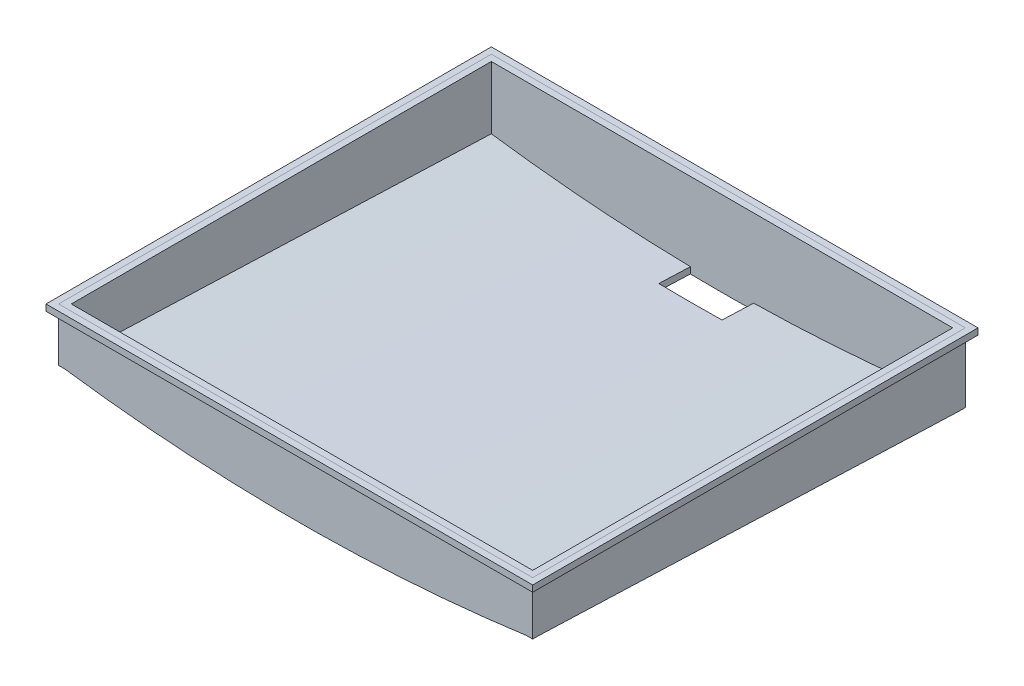
ISO-10303-21;
HEADER;
FILE_DESCRIPTION(('STEP AP214'),'2;1');
FILE_NAME('part.step','',(''),(''),'','','');
FILE_SCHEMA(('AUTOMOTIVE_DESIGN { 1 0 10303 214 1 1 1 1 }'));
ENDSEC;
DATA;
#1=APPLICATION_CONTEXT('core data for automotive mechanical design processes');
#2=APPLICATION_PROTOCOL_DEFINITION('international standard','automotive_design',2000,#1);
#3=PRODUCT_CONTEXT('',#1,'mechanical');
#4=PRODUCT('Part','Part','',(#3));
#5=PRODUCT_RELATED_PRODUCT_CATEGORY('part','',(#4));
#6=PRODUCT_DEFINITION_FORMATION('','',#4);
#7=PRODUCT_DEFINITION_CONTEXT('part definition',#1,'design');
#8=PRODUCT_DEFINITION('design','',#6,#7);
#9=PRODUCT_DEFINITION_SHAPE('','',#8);
#10=(LENGTH_UNIT() NAMED_UNIT(*) SI_UNIT(.MILLI.,.METRE.));
#11=(NAMED_UNIT(*) PLANE_ANGLE_UNIT() SI_UNIT($,.RADIAN.));
#12=(NAMED_UNIT(*) SI_UNIT($,.STERADIAN.) SOLID_ANGLE_UNIT());
#13=UNCERTAINTY_MEASURE_WITH_UNIT(LENGTH_MEASURE(1.E-05),#10,'distance_accuracy_value','');
#14=(GEOMETRIC_REPRESENTATION_CONTEXT(3) GLOBAL_UNCERTAINTY_ASSIGNED_CONTEXT((#13)) GLOBAL_UNIT_ASSIGNED_CONTEXT((#10,
#11,#12)) REPRESENTATION_CONTEXT('',''));
#15=CARTESIAN_POINT('',(0.,0.,0.));
#16=DIRECTION('',(0.,0.,1.));
#17=DIRECTION('',(1.,0.,0.));
#18=AXIS2_PLACEMENT_3D('',#15,#16,#17);
#19=CARTESIAN_POINT('',(-77.,12.8274877494664,-136.906114542662));
#20=DIRECTION('',(0.,0.,-1.));
#21=DIRECTION('',(-1.,0.,0.));
#22=AXIS2_PLACEMENT_3D('',#19,#20,#21);
#23=PLANE('',#22);
#24=DIRECTION('',(-1.,0.,0.));
#25=VECTOR('',#24,1.);
#26=CARTESIAN_POINT('',(-77.,14.8274877494664,-136.906114542662));
#27=LINE('',#26,#25);
#28=CARTESIAN_POINT('',(77.,14.8274877494664,-136.906114542662));
#29=VERTEX_POINT('',#28);
#30=CARTESIAN_POINT('',(-77.,14.8274877494664,-136.906114542662));
#31=VERTEX_POINT('',#30);
#32=EDGE_CURVE('E144',#29,#31,#27,.T.);
#33=ORIENTED_EDGE('',*,*,#32,.F.);
#34=DIRECTION('',(0.,1.,0.));
#35=VECTOR('',#34,1.);
#36=CARTESIAN_POINT('',(77.,12.8274877494664,-136.906114542662));
#37=LINE('',#36,#35);
#38=CARTESIAN_POINT('',(77.,12.8274877494664,-136.906114542662));
#39=VERTEX_POINT('',#38);
#40=EDGE_CURVE('E12',#39,#29,#37,.T.);
#41=ORIENTED_EDGE('',*,*,#40,.F.);
#42=DIRECTION('',(-1.,0.,0.));
#43=VECTOR('',#42,1.);
#44=CARTESIAN_POINT('',(-77.,12.8274877494664,-136.906114542662));
#45=LINE('',#44,#43);
#46=CARTESIAN_POINT('',(-77.,12.8274877494664,-136.906114542662));
#47=VERTEX_POINT('',#46);
#48=EDGE_CURVE('E148',#39,#47,#45,.T.);
#49=ORIENTED_EDGE('',*,*,#48,.T.);
#50=DIRECTION('',(0.,1.,0.));
#51=VECTOR('',#50,1.);
#52=CARTESIAN_POINT('',(-77.,12.8274877494664,-136.906114542662));
#53=LINE('',#52,#51);
#54=EDGE_CURVE('E49',#47,#31,#53,.T.);
#55=ORIENTED_EDGE('',*,*,#54,.T.);
#56=EDGE_LOOP('',(#33,#41,#49,#55));
#57=FACE_BOUND('',#56,.T.);
#58=ADVANCED_FACE('F46',(#57),#23,.T.);
#59=CARTESIAN_POINT('',(77.,12.8274877494664,-136.906114542662));
#60=DIRECTION('',(1.,0.,0.));
#61=DIRECTION('',(0.,0.,-1.));
#62=AXIS2_PLACEMENT_3D('',#59,#60,#61);
#63=PLANE('',#62);
#64=DIRECTION('',(0.,0.,-1.));
#65=VECTOR('',#64,1.);
#66=CARTESIAN_POINT('',(77.,14.8274877494664,-136.906114542662));
#67=LINE('',#66,#65);
#68=CARTESIAN_POINT('',(77.,14.8274877494664,4.));
#69=VERTEX_POINT('',#68);
#70=EDGE_CURVE('E152',#69,#29,#67,.T.);
#71=ORIENTED_EDGE('',*,*,#70,.F.);
#72=DIRECTION('',(0.,1.,0.));
#73=VECTOR('',#72,1.);
#74=CARTESIAN_POINT('',(77.,12.8274877494664,4.));
#75=LINE('',#74,#73);
#76=CARTESIAN_POINT('',(77.,12.8274877494664,4.));
#77=VERTEX_POINT('',#76);
#78=EDGE_CURVE('E54',#77,#69,#75,.T.);
#79=ORIENTED_EDGE('',*,*,#78,.F.);
#80=DIRECTION('',(0.,0.,-1.));
#81=VECTOR('',#80,1.);
#82=CARTESIAN_POINT('',(77.,12.8274877494664,-136.906114542662));
#83=LINE('',#82,#81);
#84=EDGE_CURVE('E158',#77,#39,#83,.T.);
#85=ORIENTED_EDGE('',*,*,#84,.T.);
#86=ORIENTED_EDGE('',*,*,#40,.T.);
#87=EDGE_LOOP('',(#71,#79,#85,#86));
#88=FACE_BOUND('',#87,.T.);
#89=ADVANCED_FACE('F184',(#88),#63,.T.);
#90=CARTESIAN_POINT('',(-77.,12.8274877494664,4.));
#91=DIRECTION('',(0.,0.,1.));
#92=DIRECTION('',(1.,0.,0.));
#93=AXIS2_PLACEMENT_3D('',#90,#91,#92);
#94=PLANE('',#93);
#95=DIRECTION('',(1.,0.,0.));
#96=VECTOR('',#95,1.);
#97=CARTESIAN_POINT('',(-77.,14.8274877494664,4.));
#98=LINE('',#97,#96);
#99=CARTESIAN_POINT('',(-77.,14.8274877494664,4.));
#100=VERTEX_POINT('',#99);
#101=EDGE_CURVE('E166',#100,#69,#98,.T.);
#102=ORIENTED_EDGE('',*,*,#101,.F.);
#103=DIRECTION('',(0.,1.,0.));
#104=VECTOR('',#103,1.);
#105=CARTESIAN_POINT('',(-77.,12.8274877494664,4.));
#106=LINE('',#105,#104);
#107=CARTESIAN_POINT('',(-77.,12.8274877494664,4.));
#108=VERTEX_POINT('',#107);
#109=EDGE_CURVE('E171',#108,#100,#106,.T.);
#110=ORIENTED_EDGE('',*,*,#109,.F.);
#111=DIRECTION('',(1.,0.,0.));
#112=VECTOR('',#111,1.);
#113=CARTESIAN_POINT('',(-77.,12.8274877494664,4.));
#114=LINE('',#113,#112);
#115=EDGE_CURVE('E155',#108,#77,#114,.T.);
#116=ORIENTED_EDGE('',*,*,#115,.T.);
#117=ORIENTED_EDGE('',*,*,#78,.T.);
#118=EDGE_LOOP('',(#102,#110,#116,#117));
#119=FACE_BOUND('',#118,.T.);
#120=ADVANCED_FACE('F188',(#119),#94,.T.);
#121=CARTESIAN_POINT('',(-77.,12.8274877494664,-136.906114542662));
#122=DIRECTION('',(-1.,0.,0.));
#123=DIRECTION('',(0.,0.,1.));
#124=AXIS2_PLACEMENT_3D('',#121,#122,#123);
#125=PLANE('',#124);
#126=DIRECTION('',(0.,0.,1.));
#127=VECTOR('',#126,1.);
#128=CARTESIAN_POINT('',(-77.,14.8274877494664,-136.906114542662));
#129=LINE('',#128,#127);
#130=EDGE_CURVE('E163',#31,#100,#129,.T.);
#131=ORIENTED_EDGE('',*,*,#130,.F.);
#132=ORIENTED_EDGE('',*,*,#54,.F.);
#133=DIRECTION('',(0.,0.,1.));
#134=VECTOR('',#133,1.);
#135=CARTESIAN_POINT('',(-77.,12.8274877494664,-136.906114542662));
#136=LINE('',#135,#134);
#137=EDGE_CURVE('E151',#47,#108,#136,.T.);
#138=ORIENTED_EDGE('',*,*,#137,.T.);
#139=ORIENTED_EDGE('',*,*,#109,.T.);
#140=EDGE_LOOP('',(#131,#132,#138,#139));
#141=FACE_BOUND('',#140,.T.);
#142=ADVANCED_FACE('F179',(#141),#125,.T.);
#143=CARTESIAN_POINT('',(0.,12.8274877494664,0.));
#144=DIRECTION('',(0.,-1.,0.));
#145=DIRECTION('',(0.,0.,-1.));
#146=AXIS2_PLACEMENT_3D('',#143,#144,#145);
#147=PLANE('',#146);
#148=DIRECTION('',(0.,0.,1.));
#149=VECTOR('',#148,1.);
#150=CARTESIAN_POINT('',(-75.,12.8274877494664,-134.906114542662));
#151=LINE('',#150,#149);
#152=CARTESIAN_POINT('',(-75.,12.8274877494664,-134.906114542662));
#153=VERTEX_POINT('',#152);
#154=CARTESIAN_POINT('',(-75.,12.8274877494664,2.));
#155=VERTEX_POINT('',#154);
#156=EDGE_CURVE('E113',#153,#155,#151,.T.);
#157=ORIENTED_EDGE('',*,*,#156,.T.);
#158=DIRECTION('',(1.,0.,0.));
#159=VECTOR('',#158,1.);
#160=CARTESIAN_POINT('',(-75.,12.8274877494664,2.));
#161=LINE('',#160,#159);
#162=CARTESIAN_POINT('',(75.,12.8274877494664,2.));
#163=VERTEX_POINT('',#162);
#164=EDGE_CURVE('E122',#155,#163,#161,.T.);
#165=ORIENTED_EDGE('',*,*,#164,.T.);
#166=DIRECTION('',(0.,0.,-1.));
#167=VECTOR('',#166,1.);
#168=CARTESIAN_POINT('',(75.,12.8274877494664,-134.906114542662));
#169=LINE('',#168,#167);
#170=CARTESIAN_POINT('',(75.,12.8274877494664,-134.906114542662));
#171=VERTEX_POINT('',#170);
#172=EDGE_CURVE('E62',#163,#171,#169,.T.);
#173=ORIENTED_EDGE('',*,*,#172,.T.);
#174=DIRECTION('',(-1.,0.,0.));
#175=VECTOR('',#174,1.);
#176=CARTESIAN_POINT('',(-75.,12.8274877494664,-134.906114542662));
#177=LINE('',#176,#175);
#178=EDGE_CURVE('E119',#171,#153,#177,.T.);
#179=ORIENTED_EDGE('',*,*,#178,.T.);
#180=EDGE_LOOP('',(#157,#165,#173,#179));
#181=FACE_BOUND('',#180,.T.);
#182=ORIENTED_EDGE('',*,*,#48,.F.);
#183=ORIENTED_EDGE('',*,*,#84,.F.);
#184=ORIENTED_EDGE('',*,*,#115,.F.);
#185=ORIENTED_EDGE('',*,*,#137,.F.);
#186=EDGE_LOOP('',(#182,#183,#184,#185));
#187=FACE_BOUND('',#186,.T.);
#188=ADVANCED_FACE('F126',(#181,#187),#147,.T.);
#189=CARTESIAN_POINT('',(0.,14.8274877494664,0.));
#190=DIRECTION('',(0.,-1.,0.));
#191=DIRECTION('',(0.,0.,-1.));
#192=AXIS2_PLACEMENT_3D('',#189,#190,#191);
#193=PLANE('',#192);
#194=DIRECTION('',(1.,0.,0.));
#195=VECTOR('',#194,1.);
#196=CARTESIAN_POINT('',(-75.,14.8274877494664,2.));
#197=LINE('',#196,#195);
#198=CARTESIAN_POINT('',(-75.,14.8274877494664,2.));
#199=VERTEX_POINT('',#198);
#200=CARTESIAN_POINT('',(75.,14.8274877494664,2.));
#201=VERTEX_POINT('',#200);
#202=EDGE_CURVE('E138',#199,#201,#197,.T.);
#203=ORIENTED_EDGE('',*,*,#202,.F.);
#204=DIRECTION('',(0.,0.,1.));
#205=VECTOR('',#204,1.);
#206=CARTESIAN_POINT('',(-75.,14.8274877494664,-134.906114542662));
#207=LINE('',#206,#205);
#208=CARTESIAN_POINT('',(-75.,14.8274877494664,-134.906114542662));
#209=VERTEX_POINT('',#208);
#210=EDGE_CURVE('E70',#209,#199,#207,.T.);
#211=ORIENTED_EDGE('',*,*,#210,.F.);
#212=DIRECTION('',(-1.,0.,0.));
#213=VECTOR('',#212,1.);
#214=CARTESIAN_POINT('',(-75.,14.8274877494664,-134.906114542662));
#215=LINE('',#214,#213);
#216=CARTESIAN_POINT('',(75.,14.8274877494664,-134.906114542662));
#217=VERTEX_POINT('',#216);
#218=EDGE_CURVE('E129',#217,#209,#215,.T.);
#219=ORIENTED_EDGE('',*,*,#218,.F.);
#220=DIRECTION('',(0.,0.,-1.));
#221=VECTOR('',#220,1.);
#222=CARTESIAN_POINT('',(75.,14.8274877494664,-134.906114542662));
#223=LINE('',#222,#221);
#224=EDGE_CURVE('E132',#201,#217,#223,.T.);
#225=ORIENTED_EDGE('',*,*,#224,.F.);
#226=EDGE_LOOP('',(#203,#211,#219,#225));
#227=FACE_BOUND('',#226,.T.);
#228=ORIENTED_EDGE('',*,*,#32,.T.);
#229=ORIENTED_EDGE('',*,*,#130,.T.);
#230=ORIENTED_EDGE('',*,*,#101,.T.);
#231=ORIENTED_EDGE('',*,*,#70,.T.);
#232=EDGE_LOOP('',(#228,#229,#230,#231));
#233=FACE_BOUND('',#232,.T.);
#234=ADVANCED_FACE('F181',(#227,#233),#193,.F.);
#235=CARTESIAN_POINT('',(-75.,12.8274877494664,-134.906114542662));
#236=DIRECTION('',(-1.,0.,0.));
#237=DIRECTION('',(0.,0.,1.));
#238=AXIS2_PLACEMENT_3D('',#235,#236,#237);
#239=PLANE('',#238);
#240=ORIENTED_EDGE('',*,*,#210,.T.);
#241=DIRECTION('',(0.,1.,0.));
#242=VECTOR('',#241,1.);
#243=CARTESIAN_POINT('',(-75.,12.8274877494664,2.));
#244=LINE('',#243,#242);
#245=EDGE_CURVE('E109',#155,#199,#244,.T.);
#246=ORIENTED_EDGE('',*,*,#245,.F.);
#247=ORIENTED_EDGE('',*,*,#156,.F.);
#248=DIRECTION('',(0.,1.,0.));
#249=VECTOR('',#248,1.);
#250=CARTESIAN_POINT('',(-75.,12.8274877494664,-134.906114542662));
#251=LINE('',#250,#249);
#252=EDGE_CURVE('E142',#153,#209,#251,.T.);
#253=ORIENTED_EDGE('',*,*,#252,.T.);
#254=EDGE_LOOP('',(#240,#246,#247,#253));
#255=FACE_BOUND('',#254,.T.);
#256=ADVANCED_FACE('F111',(#255),#239,.F.);
#257=CARTESIAN_POINT('',(-75.,12.8274877494664,-134.906114542662));
#258=DIRECTION('',(0.,0.,-1.));
#259=DIRECTION('',(-1.,0.,0.));
#260=AXIS2_PLACEMENT_3D('',#257,#258,#259);
#261=PLANE('',#260);
#262=ORIENTED_EDGE('',*,*,#218,.T.);
#263=ORIENTED_EDGE('',*,*,#252,.F.);
#264=ORIENTED_EDGE('',*,*,#178,.F.);
#265=DIRECTION('',(0.,1.,0.));
#266=VECTOR('',#265,1.);
#267=CARTESIAN_POINT('',(75.,12.8274877494664,-134.906114542662));
#268=LINE('',#267,#266);
#269=EDGE_CURVE('E145',#171,#217,#268,.T.);
#270=ORIENTED_EDGE('',*,*,#269,.T.);
#271=EDGE_LOOP('',(#262,#263,#264,#270));
#272=FACE_BOUND('',#271,.T.);
#273=ADVANCED_FACE('F239',(#272),#261,.F.);
#274=CARTESIAN_POINT('',(75.,12.8274877494664,-134.906114542662));
#275=DIRECTION('',(1.,0.,0.));
#276=DIRECTION('',(0.,0.,-1.));
#277=AXIS2_PLACEMENT_3D('',#274,#275,#276);
#278=PLANE('',#277);
#279=ORIENTED_EDGE('',*,*,#224,.T.);
#280=ORIENTED_EDGE('',*,*,#269,.F.);
#281=ORIENTED_EDGE('',*,*,#172,.F.);
#282=DIRECTION('',(0.,1.,0.));
#283=VECTOR('',#282,1.);
#284=CARTESIAN_POINT('',(75.,12.8274877494664,2.));
#285=LINE('',#284,#283);
#286=EDGE_CURVE('E118',#163,#201,#285,.T.);
#287=ORIENTED_EDGE('',*,*,#286,.T.);
#288=EDGE_LOOP('',(#279,#280,#281,#287));
#289=FACE_BOUND('',#288,.T.);
#290=ADVANCED_FACE('F248',(#289),#278,.F.);
#291=CARTESIAN_POINT('',(-75.,12.8274877494664,2.));
#292=DIRECTION('',(0.,0.,1.));
#293=DIRECTION('',(1.,0.,0.));
#294=AXIS2_PLACEMENT_3D('',#291,#292,#293);
#295=PLANE('',#294);
#296=ORIENTED_EDGE('',*,*,#202,.T.);
#297=ORIENTED_EDGE('',*,*,#286,.F.);
#298=ORIENTED_EDGE('',*,*,#164,.F.);
#299=ORIENTED_EDGE('',*,*,#245,.T.);
#300=EDGE_LOOP('',(#296,#297,#298,#299));
#301=FACE_BOUND('',#300,.T.);
#302=ADVANCED_FACE('F123',(#301),#295,.F.);
#303=CLOSED_SHELL('',(#58,#89,#120,#142,#188,#234,#256,#273,#290,#302));
#304=MANIFOLD_SOLID_BREP('B2',#303);
#305=CARTESIAN_POINT('',(0.,525.403529528471,-132.906114542662));
#306=DIRECTION('',(0.,0.,-1.));
#307=DIRECTION('',(-1.,0.,0.));
#308=AXIS2_PLACEMENT_3D('',#305,#306,#307);
#309=CIRCLE('',#308,535.4);
#310=DIRECTION('',(0.,0.0375674471543507,0.999294094305728));
#311=VECTOR('',#310,1.);
#312=SURFACE_OF_LINEAR_EXTRUSION('',#309,#311);
#313=DIRECTION('',(0.,0.0375674471543507,0.999294094305728));
#314=VECTOR('',#313,1.);
#315=CARTESIAN_POINT('',(-9.99999999999999,-9.90307420438008,-132.906114542662));
#316=LINE('',#315,#314);
#317=CARTESIAN_POINT('',(-9.99999999999999,-9.90307420438008,-132.906114542662));
#318=VERTEX_POINT('',#317);
#319=CARTESIAN_POINT('',(-10.0000000000001,-9.52713435475598,-122.906114542662));
#320=VERTEX_POINT('',#319);
#321=EDGE_CURVE('E430',#318,#320,#316,.T.);
#322=ORIENTED_EDGE('',*,*,#321,.F.);
#323=CARTESIAN_POINT('',(-73.,-4.99647047152864,-132.906114542662));
#324=VERTEX_POINT('',#323);
#325=EDGE_CURVE('E528',#318,#324,#309,.T.);
#326=ORIENTED_EDGE('',*,*,#325,.T.);
#327=DIRECTION('',(0.,0.0375674471543507,0.999294094305728));
#328=VECTOR('',#327,1.);
#329=CARTESIAN_POINT('',(-73.,-4.99647047152864,-132.906114542662));
#330=LINE('',#329,#328);
#331=CARTESIAN_POINT('',(-73.,0.,0.));
#332=VERTEX_POINT('',#331);
#333=EDGE_CURVE('E521',#324,#332,#330,.T.);
#334=ORIENTED_EDGE('',*,*,#333,.T.);
#335=CARTESIAN_POINT('',(0.,530.4,0.));
#336=DIRECTION('',(0.,0.,-1.));
#337=DIRECTION('',(-1.,0.,0.));
#338=AXIS2_PLACEMENT_3D('',#335,#336,#337);
#339=CIRCLE('',#338,535.4);
#340=CARTESIAN_POINT('',(73.,0.,0.));
#341=VERTEX_POINT('',#340);
#342=EDGE_CURVE('E529',#341,#332,#339,.T.);
#343=ORIENTED_EDGE('',*,*,#342,.F.);
#344=DIRECTION('',(0.,0.0375674471543507,0.999294094305728));
#345=VECTOR('',#344,1.);
#346=CARTESIAN_POINT('',(73.,-4.99647047152864,-132.906114542662));
#347=LINE('',#346,#345);
#348=CARTESIAN_POINT('',(73.,-4.99647047152864,-132.906114542662));
#349=VERTEX_POINT('',#348);
#350=EDGE_CURVE('E288',#349,#341,#347,.T.);
#351=ORIENTED_EDGE('',*,*,#350,.F.);
#352=CARTESIAN_POINT('',(10.,-9.90307420438008,-132.906114542662));
#353=VERTEX_POINT('',#352);
#354=EDGE_CURVE('E538',#349,#353,#309,.T.);
#355=ORIENTED_EDGE('',*,*,#354,.T.);
#356=DIRECTION('',(0.,0.0375674471543507,0.999294094305728));
#357=VECTOR('',#356,1.);
#358=CARTESIAN_POINT('',(10.,-9.90307420438008,-132.906114542662));
#359=LINE('',#358,#357);
#360=CARTESIAN_POINT('',(10.,-9.52713435475604,-122.906114542662));
#361=VERTEX_POINT('',#360);
#362=EDGE_CURVE('E415',#361,#353,#359,.F.);
#363=ORIENTED_EDGE('',*,*,#362,.F.);
#364=CARTESIAN_POINT('',(-10.0000000000001,-9.52713435475598,-122.906114542662));
#365=CARTESIAN_POINT('',(-6.66666666666675,-9.58939853285503,-122.906114542662));
#366=CARTESIAN_POINT('',(-3.33333333333342,-9.62053062190456,-122.906114542662));
#367=CARTESIAN_POINT('',(3.33333333333324,-9.62053062190458,-122.906114542662));
#368=CARTESIAN_POINT('',(6.66666666666657,-9.58939853285506,-122.906114542662));
#369=CARTESIAN_POINT('',(9.9999999999999,-9.52713435475602,-122.906114542662));
#370=B_SPLINE_CURVE_WITH_KNOTS('',3,(#364,#365,#366,#367,#368,#369),.UNSPECIFIED.,.F.,.F.,(4,2,
4),(0.,10.0004361336252,20.0008722672505),.UNSPECIFIED.);
#371=EDGE_CURVE('E419',#320,#361,#370,.T.);
#372=ORIENTED_EDGE('',*,*,#371,.F.);
#373=EDGE_LOOP('',(#322,#326,#334,#343,#351,#355,#363,#372));
#374=FACE_BOUND('',#373,.T.);
#375=ADVANCED_FACE('F275',(#374),#312,.T.);
#376=CARTESIAN_POINT('',(0.,525.403529528471,-132.906114542662));
#377=DIRECTION('',(0.,0.,1.));
#378=DIRECTION('',(-1.,0.,0.));
#379=AXIS2_PLACEMENT_3D('',#376,#377,#378);
#380=CIRCLE('',#379,537.4);
#381=DIRECTION('',(0.,0.0375674471543507,0.999294094305728));
#382=VECTOR('',#381,1.);
#383=SURFACE_OF_LINEAR_EXTRUSION('',#380,#382);
#384=DIRECTION('',(0.,0.0375674471543507,0.999294094305728));
#385=VECTOR('',#384,1.);
#386=CARTESIAN_POINT('',(-9.99999999999999,-11.903421850347,-132.906114542662));
#387=LINE('',#386,#385);
#388=CARTESIAN_POINT('',(-9.99999999999999,-11.5274820007229,-122.906114542662));
#389=VERTEX_POINT('',#388);
#390=CARTESIAN_POINT('',(-9.99999999999999,-11.903421850347,-132.906114542662));
#391=VERTEX_POINT('',#390);
#392=EDGE_CURVE('E424',#389,#391,#387,.F.);
#393=ORIENTED_EDGE('',*,*,#392,.F.);
#394=CARTESIAN_POINT('',(10.,-11.5274820007229,-122.906114542662));
#395=CARTESIAN_POINT('',(6.66666666666669,-11.5895144148439,-122.906114542662));
#396=CARTESIAN_POINT('',(3.33333333333335,-11.6205306219045,-122.906114542662));
#397=CARTESIAN_POINT('',(-3.33333333333332,-11.6205306219045,-122.906114542662));
#398=CARTESIAN_POINT('',(-6.66666666666666,-11.589514414844,-122.906114542662));
#399=CARTESIAN_POINT('',(-9.99999999999999,-11.5274820007229,-122.906114542662));
#400=B_SPLINE_CURVE_WITH_KNOTS('',3,(#394,#395,#396,#397,#398,#399),.UNSPECIFIED.,.F.,.F.,(4,2,
4),(0.,10.0004328929254,20.0008657858508),.UNSPECIFIED.);
#401=CARTESIAN_POINT('',(10.,-11.5274820007229,-122.906114542662));
#402=VERTEX_POINT('',#401);
#403=EDGE_CURVE('E44',#402,#389,#400,.T.);
#404=ORIENTED_EDGE('',*,*,#403,.F.);
#405=DIRECTION('',(0.,0.0375674471543507,0.999294094305728));
#406=VECTOR('',#405,1.);
#407=CARTESIAN_POINT('',(10.,-11.903421850347,-132.906114542662));
#408=LINE('',#407,#406);
#409=CARTESIAN_POINT('',(10.,-11.9034218503469,-132.906114542662));
#410=VERTEX_POINT('',#409);
#411=EDGE_CURVE('E405',#410,#402,#408,.T.);
#412=ORIENTED_EDGE('',*,*,#411,.F.);
#413=CARTESIAN_POINT('',(73.0000000000001,-7.01525301023644,-132.906114542662));
#414=VERTEX_POINT('',#413);
#415=EDGE_CURVE('E523',#410,#414,#380,.T.);
#416=ORIENTED_EDGE('',*,*,#415,.T.);
#417=DIRECTION('',(0.,0.0375674471543507,0.999294094305728));
#418=VECTOR('',#417,1.);
#419=CARTESIAN_POINT('',(73.0000000000001,-7.01525301023644,-132.906114542662));
#420=LINE('',#419,#418);
#421=CARTESIAN_POINT('',(73.0000000000001,-2.0187825387078,0.));
#422=VERTEX_POINT('',#421);
#423=EDGE_CURVE('E532',#414,#422,#420,.T.);
#424=ORIENTED_EDGE('',*,*,#423,.T.);
#425=CARTESIAN_POINT('',(0.,530.4,0.));
#426=DIRECTION('',(0.,0.,1.));
#427=DIRECTION('',(-1.,0.,0.));
#428=AXIS2_PLACEMENT_3D('',#425,#426,#427);
#429=CIRCLE('',#428,537.4);
#430=CARTESIAN_POINT('',(-73.0000000000001,-2.01878253870769,0.));
#431=VERTEX_POINT('',#430);
#432=EDGE_CURVE('E526',#431,#422,#429,.T.);
#433=ORIENTED_EDGE('',*,*,#432,.F.);
#434=DIRECTION('',(0.,0.0375674471543507,0.999294094305728));
#435=VECTOR('',#434,1.);
#436=CARTESIAN_POINT('',(-73.,-7.01525301023644,-132.906114542662));
#437=LINE('',#436,#435);
#438=CARTESIAN_POINT('',(-73.,-7.01525301023644,-132.906114542662));
#439=VERTEX_POINT('',#438);
#440=EDGE_CURVE('E642',#439,#431,#437,.T.);
#441=ORIENTED_EDGE('',*,*,#440,.F.);
#442=EDGE_CURVE('E427',#439,#391,#380,.T.);
#443=ORIENTED_EDGE('',*,*,#442,.T.);
#444=EDGE_LOOP('',(#393,#404,#412,#416,#424,#433,#441,#443));
#445=FACE_BOUND('',#444,.T.);
#446=ADVANCED_FACE('F422',(#445),#383,.T.);
#447=CARTESIAN_POINT('',(-73.,0.,0.));
#448=DIRECTION('',(1.,0.,0.));
#449=DIRECTION('',(0.,0.,-1.));
#450=AXIS2_PLACEMENT_3D('',#447,#448,#449);
#451=PLANE('',#450);
#452=ORIENTED_EDGE('',*,*,#333,.F.);
#453=DIRECTION('',(0.,-1.,0.));
#454=VECTOR('',#453,1.);
#455=CARTESIAN_POINT('',(-73.,-4.99647047152815,-132.906114542662));
#456=LINE('',#455,#454);
#457=CARTESIAN_POINT('',(-73.,14.8274877494664,-132.906114542662));
#458=VERTEX_POINT('',#457);
#459=EDGE_CURVE('E549',#458,#324,#456,.T.);
#460=ORIENTED_EDGE('',*,*,#459,.F.);
#461=DIRECTION('',(0.,0.,-1.));
#462=VECTOR('',#461,1.);
#463=CARTESIAN_POINT('',(-73.,14.8274877494664,-132.906114542662));
#464=LINE('',#463,#462);
#465=CARTESIAN_POINT('',(-73.,14.8274877494664,0.));
#466=VERTEX_POINT('',#465);
#467=EDGE_CURVE('E547',#466,#458,#464,.T.);
#468=ORIENTED_EDGE('',*,*,#467,.F.);
#469=DIRECTION('',(0.,1.,0.));
#470=VECTOR('',#469,1.);
#471=CARTESIAN_POINT('',(-73.,14.8274877494664,0.));
#472=LINE('',#471,#470);
#473=EDGE_CURVE('E550',#332,#466,#472,.T.);
#474=ORIENTED_EDGE('',*,*,#473,.F.);
#475=EDGE_LOOP('',(#452,#460,#468,#474));
#476=FACE_BOUND('',#475,.T.);
#477=ADVANCED_FACE('F506',(#476),#451,.T.);
#478=CARTESIAN_POINT('',(-75.,-2.01878253870781,0.));
#479=DIRECTION('',(0.,0.999294094305728,-0.0375674471543507));
#480=DIRECTION('',(0.,0.0375674471543507,0.999294094305728));
#481=AXIS2_PLACEMENT_3D('',#478,#479,#480);
#482=PLANE('',#481);
#483=ORIENTED_EDGE('',*,*,#440,.T.);
#484=DIRECTION('',(1.,0.,0.));
#485=VECTOR('',#484,1.);
#486=CARTESIAN_POINT('',(-75.,-2.01878253870781,0.));
#487=LINE('',#486,#485);
#488=CARTESIAN_POINT('',(-75.,-2.01878253870781,0.));
#489=VERTEX_POINT('',#488);
#490=EDGE_CURVE('E621',#489,#431,#487,.T.);
#491=ORIENTED_EDGE('',*,*,#490,.F.);
#492=DIRECTION('',(0.,0.0375674471543507,0.999294094305728));
#493=VECTOR('',#492,1.);
#494=CARTESIAN_POINT('',(-75.,-2.01878253870781,0.));
#495=LINE('',#494,#493);
#496=CARTESIAN_POINT('',(-75.,-7.01525301023644,-132.906114542662));
#497=VERTEX_POINT('',#496);
#498=EDGE_CURVE('E622',#497,#489,#495,.T.);
#499=ORIENTED_EDGE('',*,*,#498,.F.);
#500=DIRECTION('',(1.,0.,0.));
#501=VECTOR('',#500,1.);
#502=CARTESIAN_POINT('',(-75.,-7.01525301023644,-132.906114542662));
#503=LINE('',#502,#501);
#504=EDGE_CURVE('E618',#497,#439,#503,.T.);
#505=ORIENTED_EDGE('',*,*,#504,.T.);
#506=EDGE_LOOP('',(#483,#491,#499,#505));
#507=FACE_BOUND('',#506,.T.);
#508=ADVANCED_FACE('F509',(#507),#482,.F.);
#509=CARTESIAN_POINT('',(-75.,14.8274877494664,-132.906114542662));
#510=DIRECTION('',(0.,-1.,0.));
#511=DIRECTION('',(0.,0.,-1.));
#512=AXIS2_PLACEMENT_3D('',#509,#510,#511);
#513=PLANE('',#512);
#514=DIRECTION('',(0.,0.,-1.));
#515=VECTOR('',#514,1.);
#516=CARTESIAN_POINT('',(75.,14.8274877494664,-132.906114542662));
#517=LINE('',#516,#515);
#518=CARTESIAN_POINT('',(75.,14.8274877494664,2.));
#519=VERTEX_POINT('',#518);
#520=CARTESIAN_POINT('',(75.,14.8274877494664,-134.906114542662));
#521=VERTEX_POINT('',#520);
#522=EDGE_CURVE('E607',#519,#521,#517,.T.);
#523=ORIENTED_EDGE('',*,*,#522,.T.);
#524=DIRECTION('',(1.,0.,0.));
#525=VECTOR('',#524,1.);
#526=CARTESIAN_POINT('',(73.,14.8274877494664,-134.906114542662));
#527=LINE('',#526,#525);
#528=CARTESIAN_POINT('',(-75.,14.8274877494664,-134.906114542662));
#529=VERTEX_POINT('',#528);
#530=EDGE_CURVE('E440',#529,#521,#527,.T.);
#531=ORIENTED_EDGE('',*,*,#530,.F.);
#532=DIRECTION('',(0.,0.,-1.));
#533=VECTOR('',#532,1.);
#534=CARTESIAN_POINT('',(-75.,14.8274877494664,-132.906114542662));
#535=LINE('',#534,#533);
#536=CARTESIAN_POINT('',(-75.,14.8274877494664,2.));
#537=VERTEX_POINT('',#536);
#538=EDGE_CURVE('E605',#537,#529,#535,.T.);
#539=ORIENTED_EDGE('',*,*,#538,.F.);
#540=DIRECTION('',(-1.,0.,0.));
#541=VECTOR('',#540,1.);
#542=CARTESIAN_POINT('',(-73.,14.8274877494664,2.));
#543=LINE('',#542,#541);
#544=EDGE_CURVE('E582',#519,#537,#543,.T.);
#545=ORIENTED_EDGE('',*,*,#544,.F.);
#546=EDGE_LOOP('',(#523,#531,#539,#545));
#547=FACE_BOUND('',#546,.T.);
#548=ORIENTED_EDGE('',*,*,#467,.T.);
#549=DIRECTION('',(1.,0.,0.));
#550=VECTOR('',#549,1.);
#551=CARTESIAN_POINT('',(73.,14.8274877494664,-132.906114542662));
#552=LINE('',#551,#550);
#553=CARTESIAN_POINT('',(73.,14.8274877494664,-132.906114542662));
#554=VERTEX_POINT('',#553);
#555=EDGE_CURVE('E439',#458,#554,#552,.T.);
#556=ORIENTED_EDGE('',*,*,#555,.T.);
#557=DIRECTION('',(0.,0.,-1.));
#558=VECTOR('',#557,1.);
#559=CARTESIAN_POINT('',(73.,14.8274877494664,-132.906114542662));
#560=LINE('',#559,#558);
#561=CARTESIAN_POINT('',(73.,14.8274877494664,0.));
#562=VERTEX_POINT('',#561);
#563=EDGE_CURVE('E540',#562,#554,#560,.T.);
#564=ORIENTED_EDGE('',*,*,#563,.F.);
#565=DIRECTION('',(-1.,0.,0.));
#566=VECTOR('',#565,1.);
#567=CARTESIAN_POINT('',(-73.,14.8274877494664,0.));
#568=LINE('',#567,#566);
#569=EDGE_CURVE('E574',#562,#466,#568,.T.);
#570=ORIENTED_EDGE('',*,*,#569,.T.);
#571=EDGE_LOOP('',(#548,#556,#564,#570));
#572=FACE_BOUND('',#571,.T.);
#573=ADVANCED_FACE('F504',(#547,#572),#513,.F.);
#574=CARTESIAN_POINT('',(-75.,0.,0.));
#575=DIRECTION('',(1.,0.,0.));
#576=DIRECTION('',(0.,0.,-1.));
#577=AXIS2_PLACEMENT_3D('',#574,#575,#576);
#578=PLANE('',#577);
#579=ORIENTED_EDGE('',*,*,#538,.T.);
#580=DIRECTION('',(0.,1.,0.));
#581=VECTOR('',#580,1.);
#582=CARTESIAN_POINT('',(-75.,-7.01525301023644,-134.906114542662));
#583=LINE('',#582,#581);
#584=CARTESIAN_POINT('',(-75.,-7.01525301023644,-134.906114542662));
#585=VERTEX_POINT('',#584);
#586=EDGE_CURVE('E586',#585,#529,#583,.T.);
#587=ORIENTED_EDGE('',*,*,#586,.F.);
#588=DIRECTION('',(0.,0.,1.));
#589=VECTOR('',#588,1.);
#590=CARTESIAN_POINT('',(-75.,-7.01525301023644,-134.906114542662));
#591=LINE('',#590,#589);
#592=EDGE_CURVE('E576',#585,#497,#591,.T.);
#593=ORIENTED_EDGE('',*,*,#592,.T.);
#594=ORIENTED_EDGE('',*,*,#498,.T.);
#595=DIRECTION('',(0.,0.,-1.));
#596=VECTOR('',#595,1.);
#597=CARTESIAN_POINT('',(-75.,-2.01878253870781,2.));
#598=LINE('',#597,#596);
#599=CARTESIAN_POINT('',(-75.,-2.01878253870781,2.));
#600=VERTEX_POINT('',#599);
#601=EDGE_CURVE('E661',#600,#489,#598,.T.);
#602=ORIENTED_EDGE('',*,*,#601,.F.);
#603=DIRECTION('',(0.,-1.,0.));
#604=VECTOR('',#603,1.);
#605=CARTESIAN_POINT('',(-75.,14.8274877494664,2.));
#606=LINE('',#605,#604);
#607=EDGE_CURVE('E620',#537,#600,#606,.T.);
#608=ORIENTED_EDGE('',*,*,#607,.F.);
#609=EDGE_LOOP('',(#579,#587,#593,#594,#602,#608));
#610=FACE_BOUND('',#609,.T.);
#611=ADVANCED_FACE('F494',(#610),#578,.F.);
#612=CARTESIAN_POINT('',(73.,0.,0.));
#613=DIRECTION('',(1.,0.,0.));
#614=DIRECTION('',(0.,0.,-1.));
#615=AXIS2_PLACEMENT_3D('',#612,#613,#614);
#616=PLANE('',#615);
#617=DIRECTION('',(0.,-1.,0.));
#618=VECTOR('',#617,1.);
#619=CARTESIAN_POINT('',(73.,-7.01525301023644,-132.906114542662));
#620=LINE('',#619,#618);
#621=EDGE_CURVE('E611',#554,#349,#620,.T.);
#622=ORIENTED_EDGE('',*,*,#621,.T.);
#623=ORIENTED_EDGE('',*,*,#350,.T.);
#624=DIRECTION('',(0.,1.,0.));
#625=VECTOR('',#624,1.);
#626=CARTESIAN_POINT('',(73.,14.8274877494664,0.));
#627=LINE('',#626,#625);
#628=EDGE_CURVE('E544',#341,#562,#627,.T.);
#629=ORIENTED_EDGE('',*,*,#628,.T.);
#630=ORIENTED_EDGE('',*,*,#563,.T.);
#631=EDGE_LOOP('',(#622,#623,#629,#630));
#632=FACE_BOUND('',#631,.T.);
#633=ADVANCED_FACE('F490',(#632),#616,.F.);
#634=CARTESIAN_POINT('',(73.,-2.01878253870781,0.));
#635=DIRECTION('',(0.,0.999294094305728,-0.0375674471543507));
#636=DIRECTION('',(0.,0.0375674471543507,0.999294094305728));
#637=AXIS2_PLACEMENT_3D('',#634,#635,#636);
#638=PLANE('',#637);
#639=DIRECTION('',(0.,0.0375674471543507,0.999294094305728));
#640=VECTOR('',#639,1.);
#641=CARTESIAN_POINT('',(75.,-2.01878253870781,0.));
#642=LINE('',#641,#640);
#643=CARTESIAN_POINT('',(75.,-7.01525301023644,-132.906114542662));
#644=VERTEX_POINT('',#643);
#645=CARTESIAN_POINT('',(75.,-2.01878253870781,0.));
#646=VERTEX_POINT('',#645);
#647=EDGE_CURVE('E612',#644,#646,#642,.T.);
#648=ORIENTED_EDGE('',*,*,#647,.T.);
#649=DIRECTION('',(1.,0.,0.));
#650=VECTOR('',#649,1.);
#651=CARTESIAN_POINT('',(73.,-2.01878253870781,0.));
#652=LINE('',#651,#650);
#653=EDGE_CURVE('E543',#422,#646,#652,.T.);
#654=ORIENTED_EDGE('',*,*,#653,.F.);
#655=ORIENTED_EDGE('',*,*,#423,.F.);
#656=DIRECTION('',(1.,0.,0.));
#657=VECTOR('',#656,1.);
#658=CARTESIAN_POINT('',(73.,-7.01525301023644,-132.906114542662));
#659=LINE('',#658,#657);
#660=EDGE_CURVE('E632',#414,#644,#659,.T.);
#661=ORIENTED_EDGE('',*,*,#660,.T.);
#662=EDGE_LOOP('',(#648,#654,#655,#661));
#663=FACE_BOUND('',#662,.T.);
#664=ADVANCED_FACE('F493',(#663),#638,.F.);
#665=CARTESIAN_POINT('',(75.,0.,0.));
#666=DIRECTION('',(1.,0.,0.));
#667=DIRECTION('',(0.,0.,-1.));
#668=AXIS2_PLACEMENT_3D('',#665,#666,#667);
#669=PLANE('',#668);
#670=ORIENTED_EDGE('',*,*,#647,.F.);
#671=DIRECTION('',(0.,0.,1.));
#672=VECTOR('',#671,1.);
#673=CARTESIAN_POINT('',(75.,-7.01525301023644,-134.906114542662));
#674=LINE('',#673,#672);
#675=CARTESIAN_POINT('',(75.,-7.01525301023644,-134.906114542662));
#676=VERTEX_POINT('',#675);
#677=EDGE_CURVE('E570',#676,#644,#674,.T.);
#678=ORIENTED_EDGE('',*,*,#677,.F.);
#679=DIRECTION('',(0.,-1.,0.));
#680=VECTOR('',#679,1.);
#681=CARTESIAN_POINT('',(75.,14.8274877494664,-134.906114542662));
#682=LINE('',#681,#680);
#683=EDGE_CURVE('E599',#521,#676,#682,.T.);
#684=ORIENTED_EDGE('',*,*,#683,.F.);
#685=ORIENTED_EDGE('',*,*,#522,.F.);
#686=DIRECTION('',(0.,1.,0.));
#687=VECTOR('',#686,1.);
#688=CARTESIAN_POINT('',(75.,-2.01878253870781,2.));
#689=LINE('',#688,#687);
#690=CARTESIAN_POINT('',(75.,-2.01878253870781,2.));
#691=VERTEX_POINT('',#690);
#692=EDGE_CURVE('E670',#691,#519,#689,.T.);
#693=ORIENTED_EDGE('',*,*,#692,.F.);
#694=DIRECTION('',(0.,0.,-1.));
#695=VECTOR('',#694,1.);
#696=CARTESIAN_POINT('',(75.,-2.01878253870781,2.));
#697=LINE('',#696,#695);
#698=EDGE_CURVE('E669',#691,#646,#697,.T.);
#699=ORIENTED_EDGE('',*,*,#698,.T.);
#700=EDGE_LOOP('',(#670,#678,#684,#685,#693,#699));
#701=FACE_BOUND('',#700,.T.);
#702=ADVANCED_FACE('F478',(#701),#669,.T.);
#703=CARTESIAN_POINT('',(0.,530.4,0.));
#704=DIRECTION('',(0.,0.,1.));
#705=DIRECTION('',(1.,0.,0.));
#706=AXIS2_PLACEMENT_3D('',#703,#704,#705);
#707=PLANE('',#706);
#708=ORIENTED_EDGE('',*,*,#342,.T.);
#709=ORIENTED_EDGE('',*,*,#473,.T.);
#710=ORIENTED_EDGE('',*,*,#569,.F.);
#711=ORIENTED_EDGE('',*,*,#628,.F.);
#712=EDGE_LOOP('',(#708,#709,#710,#711));
#713=FACE_BOUND('',#712,.T.);
#714=ADVANCED_FACE('F474',(#713),#707,.F.);
#715=CARTESIAN_POINT('',(-75.,-2.01878253870781,2.));
#716=DIRECTION('',(0.,1.,0.));
#717=DIRECTION('',(-1.,0.,0.));
#718=AXIS2_PLACEMENT_3D('',#715,#716,#717);
#719=PLANE('',#718);
#720=ORIENTED_EDGE('',*,*,#490,.T.);
#721=DIRECTION('',(0.,0.,-1.));
#722=VECTOR('',#721,1.);
#723=CARTESIAN_POINT('',(-73.0000000000001,-2.01878253870769,2.));
#724=LINE('',#723,#722);
#725=CARTESIAN_POINT('',(-73.0000000000001,-2.01878253870769,2.));
#726=VERTEX_POINT('',#725);
#727=EDGE_CURVE('E662',#726,#431,#724,.T.);
#728=ORIENTED_EDGE('',*,*,#727,.F.);
#729=DIRECTION('',(1.,0.,0.));
#730=VECTOR('',#729,1.);
#731=CARTESIAN_POINT('',(-75.,-2.01878253870781,2.));
#732=LINE('',#731,#730);
#733=EDGE_CURVE('E678',#600,#726,#732,.T.);
#734=ORIENTED_EDGE('',*,*,#733,.F.);
#735=ORIENTED_EDGE('',*,*,#601,.T.);
#736=EDGE_LOOP('',(#720,#728,#734,#735));
#737=FACE_BOUND('',#736,.T.);
#738=ADVANCED_FACE('F477',(#737),#719,.F.);
#739=CARTESIAN_POINT('',(0.,530.4,2.));
#740=DIRECTION('',(0.,0.,-1.));
#741=DIRECTION('',(-1.,0.,0.));
#742=AXIS2_PLACEMENT_3D('',#739,#740,#741);
#743=CYLINDRICAL_SURFACE('',#742,537.4);
#744=ORIENTED_EDGE('',*,*,#432,.T.);
#745=DIRECTION('',(0.,0.,-1.));
#746=VECTOR('',#745,1.);
#747=CARTESIAN_POINT('',(73.0000000000001,-2.0187825387078,2.));
#748=LINE('',#747,#746);
#749=CARTESIAN_POINT('',(73.0000000000001,-2.0187825387078,2.));
#750=VERTEX_POINT('',#749);
#751=EDGE_CURVE('E665',#750,#422,#748,.T.);
#752=ORIENTED_EDGE('',*,*,#751,.F.);
#753=CARTESIAN_POINT('',(0.,530.4,2.));
#754=DIRECTION('',(0.,0.,1.));
#755=DIRECTION('',(1.,0.,0.));
#756=AXIS2_PLACEMENT_3D('',#753,#754,#755);
#757=CIRCLE('',#756,537.4);
#758=EDGE_CURVE('E676',#726,#750,#757,.T.);
#759=ORIENTED_EDGE('',*,*,#758,.F.);
#760=ORIENTED_EDGE('',*,*,#727,.T.);
#761=EDGE_LOOP('',(#744,#752,#759,#760));
#762=FACE_BOUND('',#761,.T.);
#763=ADVANCED_FACE('F482',(#762),#743,.T.);
#764=CARTESIAN_POINT('',(73.0000000000001,-2.0187825387078,2.));
#765=DIRECTION('',(0.,1.,0.));
#766=DIRECTION('',(-1.,0.,0.));
#767=AXIS2_PLACEMENT_3D('',#764,#765,#766);
#768=PLANE('',#767);
#769=ORIENTED_EDGE('',*,*,#653,.T.);
#770=ORIENTED_EDGE('',*,*,#698,.F.);
#771=DIRECTION('',(1.,0.,0.));
#772=VECTOR('',#771,1.);
#773=CARTESIAN_POINT('',(73.0000000000001,-2.0187825387078,2.));
#774=LINE('',#773,#772);
#775=EDGE_CURVE('E674',#750,#691,#774,.T.);
#776=ORIENTED_EDGE('',*,*,#775,.F.);
#777=ORIENTED_EDGE('',*,*,#751,.T.);
#778=EDGE_LOOP('',(#769,#770,#776,#777));
#779=FACE_BOUND('',#778,.T.);
#780=ADVANCED_FACE('F472',(#779),#768,.F.);
#781=CARTESIAN_POINT('',(0.,530.4,2.));
#782=DIRECTION('',(0.,0.,1.));
#783=DIRECTION('',(1.,0.,0.));
#784=AXIS2_PLACEMENT_3D('',#781,#782,#783);
#785=PLANE('',#784);
#786=ORIENTED_EDGE('',*,*,#544,.T.);
#787=ORIENTED_EDGE('',*,*,#607,.T.);
#788=ORIENTED_EDGE('',*,*,#733,.T.);
#789=ORIENTED_EDGE('',*,*,#758,.T.);
#790=ORIENTED_EDGE('',*,*,#775,.T.);
#791=ORIENTED_EDGE('',*,*,#692,.T.);
#792=EDGE_LOOP('',(#786,#787,#788,#789,#790,#791));
#793=FACE_BOUND('',#792,.T.);
#794=ADVANCED_FACE('F468',(#793),#785,.T.);
#795=CARTESIAN_POINT('',(75.,-7.01525301023644,-134.906114542662));
#796=DIRECTION('',(0.,1.,0.));
#797=DIRECTION('',(-1.,0.,0.));
#798=AXIS2_PLACEMENT_3D('',#795,#796,#797);
#799=PLANE('',#798);
#800=ORIENTED_EDGE('',*,*,#660,.F.);
#801=DIRECTION('',(0.,0.,1.));
#802=VECTOR('',#801,1.);
#803=CARTESIAN_POINT('',(73.0000000000001,-7.01525301023631,-134.906114542662));
#804=LINE('',#803,#802);
#805=CARTESIAN_POINT('',(73.0000000000001,-7.01525301023631,-134.906114542662));
#806=VERTEX_POINT('',#805);
#807=EDGE_CURVE('E566',#806,#414,#804,.T.);
#808=ORIENTED_EDGE('',*,*,#807,.F.);
#809=DIRECTION('',(-1.,0.,0.));
#810=VECTOR('',#809,1.);
#811=CARTESIAN_POINT('',(75.,-7.01525301023644,-134.906114542662));
#812=LINE('',#811,#810);
#813=EDGE_CURVE('E596',#676,#806,#812,.T.);
#814=ORIENTED_EDGE('',*,*,#813,.F.);
#815=ORIENTED_EDGE('',*,*,#677,.T.);
#816=EDGE_LOOP('',(#800,#808,#814,#815));
#817=FACE_BOUND('',#816,.T.);
#818=ADVANCED_FACE('F464',(#817),#799,.F.);
#819=CARTESIAN_POINT('',(0.,525.403529528471,-134.906114542662));
#820=DIRECTION('',(0.,0.,1.));
#821=DIRECTION('',(1.,0.,0.));
#822=AXIS2_PLACEMENT_3D('',#819,#820,#821);
#823=CYLINDRICAL_SURFACE('',#822,537.4);
#824=ORIENTED_EDGE('',*,*,#442,.F.);
#825=DIRECTION('',(0.,0.,1.));
#826=VECTOR('',#825,1.);
#827=CARTESIAN_POINT('',(-73.,-7.01525301023644,-134.906114542662));
#828=LINE('',#827,#826);
#829=CARTESIAN_POINT('',(-73.,-7.01525301023644,-134.906114542662));
#830=VERTEX_POINT('',#829);
#831=EDGE_CURVE('E571',#830,#439,#828,.T.);
#832=ORIENTED_EDGE('',*,*,#831,.F.);
#833=CARTESIAN_POINT('',(0.,525.403529528471,-134.906114542662));
#834=DIRECTION('',(0.,0.,-1.));
#835=DIRECTION('',(-1.,0.,0.));
#836=AXIS2_PLACEMENT_3D('',#833,#834,#835);
#837=CIRCLE('',#836,537.4);
#838=EDGE_CURVE('E567',#806,#830,#837,.T.);
#839=ORIENTED_EDGE('',*,*,#838,.F.);
#840=ORIENTED_EDGE('',*,*,#807,.T.);
#841=ORIENTED_EDGE('',*,*,#415,.F.);
#842=EDGE_CURVE('E522',#391,#410,#380,.T.);
#843=ORIENTED_EDGE('',*,*,#842,.F.);
#844=EDGE_LOOP('',(#824,#832,#839,#840,#841,#843));
#845=FACE_BOUND('',#844,.T.);
#846=ADVANCED_FACE('F460',(#845),#823,.T.);
#847=CARTESIAN_POINT('',(-73.,-7.01525301023644,-134.906114542662));
#848=DIRECTION('',(0.,1.,0.));
#849=DIRECTION('',(0.,0.,1.));
#850=AXIS2_PLACEMENT_3D('',#847,#848,#849);
#851=PLANE('',#850);
#852=ORIENTED_EDGE('',*,*,#504,.F.);
#853=ORIENTED_EDGE('',*,*,#592,.F.);
#854=DIRECTION('',(-1.,0.,0.));
#855=VECTOR('',#854,1.);
#856=CARTESIAN_POINT('',(-73.,-7.01525301023644,-134.906114542662));
#857=LINE('',#856,#855);
#858=EDGE_CURVE('E593',#830,#585,#857,.T.);
#859=ORIENTED_EDGE('',*,*,#858,.F.);
#860=ORIENTED_EDGE('',*,*,#831,.T.);
#861=EDGE_LOOP('',(#852,#853,#859,#860));
#862=FACE_BOUND('',#861,.T.);
#863=ADVANCED_FACE('F454',(#862),#851,.F.);
#864=CARTESIAN_POINT('',(0.,525.403529528471,-134.906114542662));
#865=DIRECTION('',(0.,0.,-1.));
#866=DIRECTION('',(-1.,0.,0.));
#867=AXIS2_PLACEMENT_3D('',#864,#865,#866);
#868=PLANE('',#867);
#869=ORIENTED_EDGE('',*,*,#530,.T.);
#870=ORIENTED_EDGE('',*,*,#683,.T.);
#871=ORIENTED_EDGE('',*,*,#813,.T.);
#872=ORIENTED_EDGE('',*,*,#838,.T.);
#873=ORIENTED_EDGE('',*,*,#858,.T.);
#874=ORIENTED_EDGE('',*,*,#586,.T.);
#875=EDGE_LOOP('',(#869,#870,#871,#872,#873,#874));
#876=FACE_BOUND('',#875,.T.);
#877=ADVANCED_FACE('F451',(#876),#868,.T.);
#878=CARTESIAN_POINT('',(0.,525.403529528471,-132.906114542662));
#879=DIRECTION('',(0.,0.,-1.));
#880=DIRECTION('',(-1.,0.,0.));
#881=AXIS2_PLACEMENT_3D('',#878,#879,#880);
#882=PLANE('',#881);
#883=ORIENTED_EDGE('',*,*,#621,.F.);
#884=ORIENTED_EDGE('',*,*,#555,.F.);
#885=ORIENTED_EDGE('',*,*,#459,.T.);
#886=ORIENTED_EDGE('',*,*,#325,.F.);
#887=DIRECTION('',(0.,1.,0.));
#888=VECTOR('',#887,1.);
#889=CARTESIAN_POINT('',(-9.99999999999999,-11.9964704715285,-132.906114542662));
#890=LINE('',#889,#888);
#891=EDGE_CURVE('E302',#391,#318,#890,.T.);
#892=ORIENTED_EDGE('',*,*,#891,.F.);
#893=ORIENTED_EDGE('',*,*,#842,.T.);
#894=DIRECTION('',(0.,1.,0.));
#895=VECTOR('',#894,1.);
#896=CARTESIAN_POINT('',(10.,-11.9964704715285,-132.906114542662));
#897=LINE('',#896,#895);
#898=EDGE_CURVE('E411',#410,#353,#897,.T.);
#899=ORIENTED_EDGE('',*,*,#898,.T.);
#900=ORIENTED_EDGE('',*,*,#354,.F.);
#901=EDGE_LOOP('',(#883,#884,#885,#886,#892,#893,#899,#900));
#902=FACE_BOUND('',#901,.T.);
#903=ADVANCED_FACE('F450',(#902),#882,.F.);
#904=CARTESIAN_POINT('',(-9.99999999999999,-11.9964704715285,-122.906114542662));
#905=DIRECTION('',(-1.,0.,0.));
#906=DIRECTION('',(0.,0.,1.));
#907=AXIS2_PLACEMENT_3D('',#904,#905,#906);
#908=PLANE('',#907);
#909=ORIENTED_EDGE('',*,*,#321,.T.);
#910=DIRECTION('',(0.,1.,0.));
#911=VECTOR('',#910,1.);
#912=CARTESIAN_POINT('',(-9.99999999999999,-11.9964704715285,-122.906114542662));
#913=LINE('',#912,#911);
#914=EDGE_CURVE('E294',#389,#320,#913,.T.);
#915=ORIENTED_EDGE('',*,*,#914,.F.);
#916=ORIENTED_EDGE('',*,*,#392,.T.);
#917=ORIENTED_EDGE('',*,*,#891,.T.);
#918=EDGE_LOOP('',(#909,#915,#916,#917));
#919=FACE_BOUND('',#918,.T.);
#920=ADVANCED_FACE('F446',(#919),#908,.F.);
#921=CARTESIAN_POINT('',(10.,-11.9964704715285,-122.906114542662));
#922=DIRECTION('',(1.,0.,0.));
#923=DIRECTION('',(0.,0.,-1.));
#924=AXIS2_PLACEMENT_3D('',#921,#922,#923);
#925=PLANE('',#924);
#926=ORIENTED_EDGE('',*,*,#362,.T.);
#927=ORIENTED_EDGE('',*,*,#898,.F.);
#928=ORIENTED_EDGE('',*,*,#411,.T.);
#929=DIRECTION('',(0.,1.,0.));
#930=VECTOR('',#929,1.);
#931=CARTESIAN_POINT('',(10.,-11.9964704715285,-122.906114542662));
#932=LINE('',#931,#930);
#933=EDGE_CURVE('E408',#402,#361,#932,.T.);
#934=ORIENTED_EDGE('',*,*,#933,.T.);
#935=EDGE_LOOP('',(#926,#927,#928,#934));
#936=FACE_BOUND('',#935,.T.);
#937=ADVANCED_FACE('F407',(#936),#925,.F.);
#938=CARTESIAN_POINT('',(10.,-11.9964704715285,-122.906114542662));
#939=DIRECTION('',(0.,0.,1.));
#940=DIRECTION('',(1.,0.,0.));
#941=AXIS2_PLACEMENT_3D('',#938,#939,#940);
#942=PLANE('',#941);
#943=ORIENTED_EDGE('',*,*,#371,.T.);
#944=ORIENTED_EDGE('',*,*,#933,.F.);
#945=ORIENTED_EDGE('',*,*,#403,.T.);
#946=ORIENTED_EDGE('',*,*,#914,.T.);
#947=EDGE_LOOP('',(#943,#944,#945,#946));
#948=FACE_BOUND('',#947,.T.);
#949=ADVANCED_FACE('F417',(#948),#942,.F.);
#950=CLOSED_SHELL('',(#375,#446,#477,#508,#573,#611,#633,#664,#702,#714,#738,#763,#780,#794,
#818,#846,#863,#877,#903,#920,#937,#949));
#951=MANIFOLD_SOLID_BREP('B6',#950);
#952=ADVANCED_BREP_SHAPE_REPRESENTATION('',(#18,#304,#951),#14);
#953=SHAPE_DEFINITION_REPRESENTATION(#9,#952);
ENDSEC;
END-ISO-10303-21;
